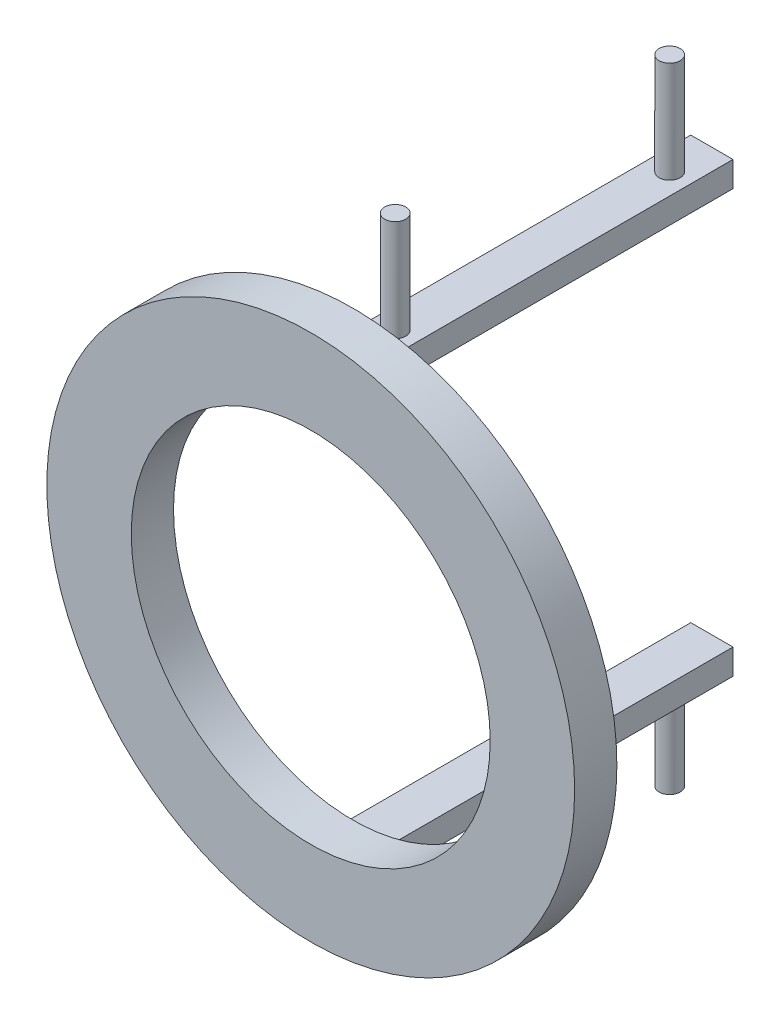
ISO-10303-21;
HEADER;
FILE_DESCRIPTION(('STEP AP214'),'2;1');
FILE_NAME('part.step','',(''),(''),'','','');
FILE_SCHEMA(('AUTOMOTIVE_DESIGN { 1 0 10303 214 1 1 1 1 }'));
ENDSEC;
DATA;
#1=APPLICATION_CONTEXT('core data for automotive mechanical design processes');
#2=APPLICATION_PROTOCOL_DEFINITION('international standard','automotive_design',2000,#1);
#3=PRODUCT_CONTEXT('',#1,'mechanical');
#4=PRODUCT('Part','Part','',(#3));
#5=PRODUCT_RELATED_PRODUCT_CATEGORY('part','',(#4));
#6=PRODUCT_DEFINITION_FORMATION('','',#4);
#7=PRODUCT_DEFINITION_CONTEXT('part definition',#1,'design');
#8=PRODUCT_DEFINITION('design','',#6,#7);
#9=PRODUCT_DEFINITION_SHAPE('','',#8);
#10=(LENGTH_UNIT() NAMED_UNIT(*) SI_UNIT(.MILLI.,.METRE.));
#11=(NAMED_UNIT(*) PLANE_ANGLE_UNIT() SI_UNIT($,.RADIAN.));
#12=(NAMED_UNIT(*) SI_UNIT($,.STERADIAN.) SOLID_ANGLE_UNIT());
#13=UNCERTAINTY_MEASURE_WITH_UNIT(LENGTH_MEASURE(1.E-05),#10,'distance_accuracy_value','');
#14=(GEOMETRIC_REPRESENTATION_CONTEXT(3) GLOBAL_UNCERTAINTY_ASSIGNED_CONTEXT((#13)) GLOBAL_UNIT_ASSIGNED_CONTEXT((#10,
#11,#12)) REPRESENTATION_CONTEXT('',''));
#15=CARTESIAN_POINT('',(0.,0.,0.));
#16=DIRECTION('',(0.,0.,1.));
#17=DIRECTION('',(1.,0.,0.));
#18=AXIS2_PLACEMENT_3D('',#15,#16,#17);
#19=CARTESIAN_POINT('',(0.,0.,0.));
#20=DIRECTION('',(0.,0.,1.));
#21=DIRECTION('',(1.,0.,0.));
#22=AXIS2_PLACEMENT_3D('',#19,#20,#21);
#23=PLANE('',#22);
#24=DIRECTION('',(0.,1.,0.));
#25=VECTOR('',#24,1.);
#26=CARTESIAN_POINT('',(-1.,10.6,0.));
#27=LINE('',#26,#25);
#28=CARTESIAN_POINT('',(-1.,9.4,0.));
#29=VERTEX_POINT('',#28);
#30=CARTESIAN_POINT('',(-1.,10.6,0.));
#31=VERTEX_POINT('',#30);
#32=EDGE_CURVE('E129',#29,#31,#27,.T.);
#33=ORIENTED_EDGE('',*,*,#32,.F.);
#34=DIRECTION('',(-1.,0.,0.));
#35=VECTOR('',#34,1.);
#36=CARTESIAN_POINT('',(1.,9.4,0.));
#37=LINE('',#36,#35);
#38=CARTESIAN_POINT('',(1.,9.4,0.));
#39=VERTEX_POINT('',#38);
#40=EDGE_CURVE('E145',#39,#29,#37,.T.);
#41=ORIENTED_EDGE('',*,*,#40,.F.);
#42=DIRECTION('',(0.,-1.,0.));
#43=VECTOR('',#42,1.);
#44=CARTESIAN_POINT('',(1.,10.6,0.));
#45=LINE('',#44,#43);
#46=CARTESIAN_POINT('',(1.,10.6,0.));
#47=VERTEX_POINT('',#46);
#48=EDGE_CURVE('E158',#47,#39,#45,.T.);
#49=ORIENTED_EDGE('',*,*,#48,.F.);
#50=DIRECTION('',(1.,0.,0.));
#51=VECTOR('',#50,1.);
#52=CARTESIAN_POINT('',(1.,10.6,0.));
#53=LINE('',#52,#51);
#54=EDGE_CURVE('E134',#31,#47,#53,.T.);
#55=ORIENTED_EDGE('',*,*,#54,.F.);
#56=EDGE_LOOP('',(#33,#41,#49,#55));
#57=FACE_BOUND('',#56,.T.);
#58=CARTESIAN_POINT('',(0.,0.,0.));
#59=DIRECTION('',(0.,0.,1.));
#60=DIRECTION('',(1.,0.,0.));
#61=AXIS2_PLACEMENT_3D('',#58,#59,#60);
#62=CIRCLE('',#61,8.5);
#63=CARTESIAN_POINT('',(8.5,0.,0.));
#64=VERTEX_POINT('',#63);
#65=EDGE_CURVE('E181',#64,#64,#62,.T.);
#66=ORIENTED_EDGE('',*,*,#65,.T.);
#67=EDGE_LOOP('',(#66));
#68=FACE_BOUND('',#67,.T.);
#69=CARTESIAN_POINT('',(0.,0.,0.));
#70=DIRECTION('',(0.,0.,1.));
#71=DIRECTION('',(1.,0.,0.));
#72=AXIS2_PLACEMENT_3D('',#69,#70,#71);
#73=CIRCLE('',#72,12.5);
#74=CARTESIAN_POINT('',(12.5,0.,0.));
#75=VERTEX_POINT('',#74);
#76=EDGE_CURVE('E185',#75,#75,#73,.T.);
#77=ORIENTED_EDGE('',*,*,#76,.F.);
#78=EDGE_LOOP('',(#77));
#79=FACE_BOUND('',#78,.T.);
#80=DIRECTION('',(0.,-1.,0.));
#81=VECTOR('',#80,1.);
#82=CARTESIAN_POINT('',(1.,-10.6,0.));
#83=LINE('',#82,#81);
#84=CARTESIAN_POINT('',(1.,-9.4,0.));
#85=VERTEX_POINT('',#84);
#86=CARTESIAN_POINT('',(1.,-10.6,0.));
#87=VERTEX_POINT('',#86);
#88=EDGE_CURVE('E127',#85,#87,#83,.T.);
#89=ORIENTED_EDGE('',*,*,#88,.F.);
#90=DIRECTION('',(1.,0.,0.));
#91=VECTOR('',#90,1.);
#92=CARTESIAN_POINT('',(1.,-9.4,0.));
#93=LINE('',#92,#91);
#94=CARTESIAN_POINT('',(-1.,-9.4,0.));
#95=VERTEX_POINT('',#94);
#96=EDGE_CURVE('E124',#95,#85,#93,.T.);
#97=ORIENTED_EDGE('',*,*,#96,.F.);
#98=DIRECTION('',(0.,1.,0.));
#99=VECTOR('',#98,1.);
#100=CARTESIAN_POINT('',(-1.,-10.6,0.));
#101=LINE('',#100,#99);
#102=CARTESIAN_POINT('',(-1.,-10.6,0.));
#103=VERTEX_POINT('',#102);
#104=EDGE_CURVE('E60',#103,#95,#101,.T.);
#105=ORIENTED_EDGE('',*,*,#104,.F.);
#106=DIRECTION('',(-1.,0.,0.));
#107=VECTOR('',#106,1.);
#108=CARTESIAN_POINT('',(1.,-10.6,0.));
#109=LINE('',#108,#107);
#110=EDGE_CURVE('E55',#87,#103,#109,.T.);
#111=ORIENTED_EDGE('',*,*,#110,.F.);
#112=EDGE_LOOP('',(#89,#97,#105,#111));
#113=FACE_BOUND('',#112,.T.);
#114=ADVANCED_FACE('F39',(#57,#68,#79,#113),#23,.F.);
#115=CARTESIAN_POINT('',(0.,0.,2.));
#116=DIRECTION('',(0.,0.,-1.));
#117=DIRECTION('',(-1.,0.,0.));
#118=AXIS2_PLACEMENT_3D('',#115,#116,#117);
#119=CYLINDRICAL_SURFACE('',#118,12.5);
#120=CARTESIAN_POINT('',(0.,0.,2.));
#121=DIRECTION('',(0.,0.,1.));
#122=DIRECTION('',(1.,0.,0.));
#123=AXIS2_PLACEMENT_3D('',#120,#121,#122);
#124=CIRCLE('',#123,12.5);
#125=CARTESIAN_POINT('',(12.5,0.,2.));
#126=VERTEX_POINT('',#125);
#127=EDGE_CURVE('E189',#126,#126,#124,.T.);
#128=ORIENTED_EDGE('',*,*,#127,.F.);
#129=EDGE_LOOP('',(#128));
#130=FACE_BOUND('',#129,.T.);
#131=ORIENTED_EDGE('',*,*,#76,.T.);
#132=EDGE_LOOP('',(#131));
#133=FACE_BOUND('',#132,.T.);
#134=ADVANCED_FACE('F41',(#130,#133),#119,.T.);
#135=CARTESIAN_POINT('',(0.,0.,2.));
#136=DIRECTION('',(0.,0.,1.));
#137=DIRECTION('',(1.,0.,0.));
#138=AXIS2_PLACEMENT_3D('',#135,#136,#137);
#139=PLANE('',#138);
#140=CARTESIAN_POINT('',(0.,0.,2.));
#141=DIRECTION('',(0.,0.,1.));
#142=DIRECTION('',(1.,0.,0.));
#143=AXIS2_PLACEMENT_3D('',#140,#141,#142);
#144=CIRCLE('',#143,8.5);
#145=CARTESIAN_POINT('',(8.5,0.,2.));
#146=VERTEX_POINT('',#145);
#147=EDGE_CURVE('E180',#146,#146,#144,.T.);
#148=ORIENTED_EDGE('',*,*,#147,.F.);
#149=EDGE_LOOP('',(#148));
#150=FACE_BOUND('',#149,.T.);
#151=ORIENTED_EDGE('',*,*,#127,.T.);
#152=EDGE_LOOP('',(#151));
#153=FACE_BOUND('',#152,.T.);
#154=ADVANCED_FACE('F228',(#150,#153),#139,.T.);
#155=CARTESIAN_POINT('',(0.,0.,0.));
#156=DIRECTION('',(0.,0.,1.));
#157=DIRECTION('',(1.,0.,0.));
#158=AXIS2_PLACEMENT_3D('',#155,#156,#157);
#159=CYLINDRICAL_SURFACE('',#158,8.5);
#160=ORIENTED_EDGE('',*,*,#65,.F.);
#161=EDGE_LOOP('',(#160));
#162=FACE_BOUND('',#161,.T.);
#163=ORIENTED_EDGE('',*,*,#147,.T.);
#164=EDGE_LOOP('',(#163));
#165=FACE_BOUND('',#164,.T.);
#166=ADVANCED_FACE('F234',(#162,#165),#159,.F.);
#167=CARTESIAN_POINT('',(-1.,10.6,-17.));
#168=DIRECTION('',(1.,0.,0.));
#169=DIRECTION('',(0.,0.,-1.));
#170=AXIS2_PLACEMENT_3D('',#167,#168,#169);
#171=PLANE('',#170);
#172=ORIENTED_EDGE('',*,*,#32,.T.);
#173=DIRECTION('',(0.,0.,1.));
#174=VECTOR('',#173,1.);
#175=CARTESIAN_POINT('',(-1.,10.6,-17.));
#176=LINE('',#175,#174);
#177=CARTESIAN_POINT('',(-1.,10.6,-17.));
#178=VERTEX_POINT('',#177);
#179=EDGE_CURVE('E176',#178,#31,#176,.T.);
#180=ORIENTED_EDGE('',*,*,#179,.F.);
#181=DIRECTION('',(0.,1.,0.));
#182=VECTOR('',#181,1.);
#183=CARTESIAN_POINT('',(-1.,10.6,-17.));
#184=LINE('',#183,#182);
#185=CARTESIAN_POINT('',(-1.,9.4,-17.));
#186=VERTEX_POINT('',#185);
#187=EDGE_CURVE('E140',#186,#178,#184,.T.);
#188=ORIENTED_EDGE('',*,*,#187,.F.);
#189=DIRECTION('',(0.,0.,1.));
#190=VECTOR('',#189,1.);
#191=CARTESIAN_POINT('',(-1.,9.4,-17.));
#192=LINE('',#191,#190);
#193=EDGE_CURVE('E153',#186,#29,#192,.T.);
#194=ORIENTED_EDGE('',*,*,#193,.T.);
#195=EDGE_LOOP('',(#172,#180,#188,#194));
#196=FACE_BOUND('',#195,.T.);
#197=ADVANCED_FACE('F238',(#196),#171,.F.);
#198=CARTESIAN_POINT('',(1.,10.6,-17.));
#199=DIRECTION('',(0.,-1.,0.));
#200=DIRECTION('',(0.,0.,-1.));
#201=AXIS2_PLACEMENT_3D('',#198,#199,#200);
#202=PLANE('',#201);
#203=CARTESIAN_POINT('',(0.,10.6,-15.));
#204=DIRECTION('',(0.,-1.,0.));
#205=DIRECTION('',(0.,0.,-1.));
#206=AXIS2_PLACEMENT_3D('',#203,#204,#205);
#207=CIRCLE('',#206,0.5);
#208=CARTESIAN_POINT('',(0.,10.6,-15.5));
#209=VERTEX_POINT('',#208);
#210=EDGE_CURVE('E200',#209,#209,#207,.F.);
#211=ORIENTED_EDGE('',*,*,#210,.F.);
#212=EDGE_LOOP('',(#211));
#213=FACE_BOUND('',#212,.T.);
#214=CARTESIAN_POINT('',(0.,10.6,-2.));
#215=DIRECTION('',(0.,-1.,0.));
#216=DIRECTION('',(0.,0.,-1.));
#217=AXIS2_PLACEMENT_3D('',#214,#215,#216);
#218=CIRCLE('',#217,0.5);
#219=CARTESIAN_POINT('',(0.,10.6,-2.5));
#220=VERTEX_POINT('',#219);
#221=EDGE_CURVE('E193',#220,#220,#218,.F.);
#222=ORIENTED_EDGE('',*,*,#221,.F.);
#223=EDGE_LOOP('',(#222));
#224=FACE_BOUND('',#223,.T.);
#225=ORIENTED_EDGE('',*,*,#54,.T.);
#226=DIRECTION('',(0.,0.,1.));
#227=VECTOR('',#226,1.);
#228=CARTESIAN_POINT('',(1.,10.6,-17.));
#229=LINE('',#228,#227);
#230=CARTESIAN_POINT('',(1.,10.6,-17.));
#231=VERTEX_POINT('',#230);
#232=EDGE_CURVE('E172',#231,#47,#229,.T.);
#233=ORIENTED_EDGE('',*,*,#232,.F.);
#234=DIRECTION('',(1.,0.,0.));
#235=VECTOR('',#234,1.);
#236=CARTESIAN_POINT('',(1.,10.6,-17.));
#237=LINE('',#236,#235);
#238=EDGE_CURVE('E144',#178,#231,#237,.T.);
#239=ORIENTED_EDGE('',*,*,#238,.F.);
#240=ORIENTED_EDGE('',*,*,#179,.T.);
#241=EDGE_LOOP('',(#225,#233,#239,#240));
#242=FACE_BOUND('',#241,.T.);
#243=ADVANCED_FACE('F242',(#213,#224,#242),#202,.F.);
#244=CARTESIAN_POINT('',(1.,10.6,-17.));
#245=DIRECTION('',(-1.,0.,0.));
#246=DIRECTION('',(0.,0.,1.));
#247=AXIS2_PLACEMENT_3D('',#244,#245,#246);
#248=PLANE('',#247);
#249=ORIENTED_EDGE('',*,*,#48,.T.);
#250=DIRECTION('',(0.,0.,1.));
#251=VECTOR('',#250,1.);
#252=CARTESIAN_POINT('',(1.,9.4,-17.));
#253=LINE('',#252,#251);
#254=CARTESIAN_POINT('',(1.,9.4,-17.));
#255=VERTEX_POINT('',#254);
#256=EDGE_CURVE('E168',#255,#39,#253,.T.);
#257=ORIENTED_EDGE('',*,*,#256,.F.);
#258=DIRECTION('',(0.,-1.,0.));
#259=VECTOR('',#258,1.);
#260=CARTESIAN_POINT('',(1.,10.6,-17.));
#261=LINE('',#260,#259);
#262=EDGE_CURVE('E148',#231,#255,#261,.T.);
#263=ORIENTED_EDGE('',*,*,#262,.F.);
#264=ORIENTED_EDGE('',*,*,#232,.T.);
#265=EDGE_LOOP('',(#249,#257,#263,#264));
#266=FACE_BOUND('',#265,.T.);
#267=ADVANCED_FACE('F246',(#266),#248,.F.);
#268=CARTESIAN_POINT('',(1.,9.4,-17.));
#269=DIRECTION('',(0.,1.,0.));
#270=DIRECTION('',(0.,0.,1.));
#271=AXIS2_PLACEMENT_3D('',#268,#269,#270);
#272=PLANE('',#271);
#273=ORIENTED_EDGE('',*,*,#40,.T.);
#274=ORIENTED_EDGE('',*,*,#193,.F.);
#275=DIRECTION('',(-1.,0.,0.));
#276=VECTOR('',#275,1.);
#277=CARTESIAN_POINT('',(1.,9.4,-17.));
#278=LINE('',#277,#276);
#279=EDGE_CURVE('E151',#255,#186,#278,.T.);
#280=ORIENTED_EDGE('',*,*,#279,.F.);
#281=ORIENTED_EDGE('',*,*,#256,.T.);
#282=EDGE_LOOP('',(#273,#274,#280,#281));
#283=FACE_BOUND('',#282,.T.);
#284=ADVANCED_FACE('F250',(#283),#272,.F.);
#285=CARTESIAN_POINT('',(0.,0.,-17.));
#286=DIRECTION('',(0.,0.,-1.));
#287=DIRECTION('',(-1.,0.,0.));
#288=AXIS2_PLACEMENT_3D('',#285,#286,#287);
#289=PLANE('',#288);
#290=ORIENTED_EDGE('',*,*,#187,.T.);
#291=ORIENTED_EDGE('',*,*,#238,.T.);
#292=ORIENTED_EDGE('',*,*,#262,.T.);
#293=ORIENTED_EDGE('',*,*,#279,.T.);
#294=EDGE_LOOP('',(#290,#291,#292,#293));
#295=FACE_BOUND('',#294,.T.);
#296=ADVANCED_FACE('F220',(#295),#289,.T.);
#297=CARTESIAN_POINT('',(1.,-10.6,-17.));
#298=DIRECTION('',(-1.,0.,0.));
#299=DIRECTION('',(0.,0.,1.));
#300=AXIS2_PLACEMENT_3D('',#297,#298,#299);
#301=PLANE('',#300);
#302=ORIENTED_EDGE('',*,*,#88,.T.);
#303=DIRECTION('',(0.,0.,1.));
#304=VECTOR('',#303,1.);
#305=CARTESIAN_POINT('',(1.,-10.6,-17.));
#306=LINE('',#305,#304);
#307=CARTESIAN_POINT('',(1.,-10.6,-17.));
#308=VERTEX_POINT('',#307);
#309=EDGE_CURVE('E106',#308,#87,#306,.T.);
#310=ORIENTED_EDGE('',*,*,#309,.F.);
#311=DIRECTION('',(0.,-1.,0.));
#312=VECTOR('',#311,1.);
#313=CARTESIAN_POINT('',(1.,-10.6,-17.));
#314=LINE('',#313,#312);
#315=CARTESIAN_POINT('',(1.,-9.4,-17.));
#316=VERTEX_POINT('',#315);
#317=EDGE_CURVE('E114',#316,#308,#314,.T.);
#318=ORIENTED_EDGE('',*,*,#317,.F.);
#319=DIRECTION('',(0.,0.,1.));
#320=VECTOR('',#319,1.);
#321=CARTESIAN_POINT('',(1.,-9.4,-17.));
#322=LINE('',#321,#320);
#323=EDGE_CURVE('E413',#316,#85,#322,.T.);
#324=ORIENTED_EDGE('',*,*,#323,.T.);
#325=EDGE_LOOP('',(#302,#310,#318,#324));
#326=FACE_BOUND('',#325,.T.);
#327=ADVANCED_FACE('F126',(#326),#301,.F.);
#328=CARTESIAN_POINT('',(1.,-10.6,-17.));
#329=DIRECTION('',(0.,1.,0.));
#330=DIRECTION('',(0.,0.,1.));
#331=AXIS2_PLACEMENT_3D('',#328,#329,#330);
#332=PLANE('',#331);
#333=CARTESIAN_POINT('',(0.,-10.6,-15.));
#334=DIRECTION('',(0.,1.,0.));
#335=DIRECTION('',(0.,0.,1.));
#336=AXIS2_PLACEMENT_3D('',#333,#334,#335);
#337=CIRCLE('',#336,0.5);
#338=CARTESIAN_POINT('',(0.,-10.6,-14.5));
#339=VERTEX_POINT('',#338);
#340=EDGE_CURVE('E11',#339,#339,#337,.F.);
#341=ORIENTED_EDGE('',*,*,#340,.F.);
#342=EDGE_LOOP('',(#341));
#343=FACE_BOUND('',#342,.T.);
#344=CARTESIAN_POINT('',(0.,-10.6,-2.));
#345=DIRECTION('',(0.,1.,0.));
#346=DIRECTION('',(0.,0.,1.));
#347=AXIS2_PLACEMENT_3D('',#344,#345,#346);
#348=CIRCLE('',#347,0.5);
#349=CARTESIAN_POINT('',(0.,-10.6,-1.5));
#350=VERTEX_POINT('',#349);
#351=EDGE_CURVE('E48',#350,#350,#348,.F.);
#352=ORIENTED_EDGE('',*,*,#351,.F.);
#353=EDGE_LOOP('',(#352));
#354=FACE_BOUND('',#353,.T.);
#355=ORIENTED_EDGE('',*,*,#110,.T.);
#356=DIRECTION('',(0.,0.,1.));
#357=VECTOR('',#356,1.);
#358=CARTESIAN_POINT('',(-1.,-10.6,-17.));
#359=LINE('',#358,#357);
#360=CARTESIAN_POINT('',(-1.,-10.6,-17.));
#361=VERTEX_POINT('',#360);
#362=EDGE_CURVE('E109',#361,#103,#359,.T.);
#363=ORIENTED_EDGE('',*,*,#362,.F.);
#364=DIRECTION('',(-1.,0.,0.));
#365=VECTOR('',#364,1.);
#366=CARTESIAN_POINT('',(1.,-10.6,-17.));
#367=LINE('',#366,#365);
#368=EDGE_CURVE('E102',#308,#361,#367,.T.);
#369=ORIENTED_EDGE('',*,*,#368,.F.);
#370=ORIENTED_EDGE('',*,*,#309,.T.);
#371=EDGE_LOOP('',(#355,#363,#369,#370));
#372=FACE_BOUND('',#371,.T.);
#373=ADVANCED_FACE('F104',(#343,#354,#372),#332,.F.);
#374=CARTESIAN_POINT('',(-1.,-10.6,-17.));
#375=DIRECTION('',(1.,0.,0.));
#376=DIRECTION('',(0.,0.,-1.));
#377=AXIS2_PLACEMENT_3D('',#374,#375,#376);
#378=PLANE('',#377);
#379=ORIENTED_EDGE('',*,*,#104,.T.);
#380=DIRECTION('',(0.,0.,1.));
#381=VECTOR('',#380,1.);
#382=CARTESIAN_POINT('',(-1.,-9.4,-17.));
#383=LINE('',#382,#381);
#384=CARTESIAN_POINT('',(-1.,-9.4,-17.));
#385=VERTEX_POINT('',#384);
#386=EDGE_CURVE('E136',#385,#95,#383,.T.);
#387=ORIENTED_EDGE('',*,*,#386,.F.);
#388=DIRECTION('',(0.,1.,0.));
#389=VECTOR('',#388,1.);
#390=CARTESIAN_POINT('',(-1.,-10.6,-17.));
#391=LINE('',#390,#389);
#392=EDGE_CURVE('E113',#361,#385,#391,.T.);
#393=ORIENTED_EDGE('',*,*,#392,.F.);
#394=ORIENTED_EDGE('',*,*,#362,.T.);
#395=EDGE_LOOP('',(#379,#387,#393,#394));
#396=FACE_BOUND('',#395,.T.);
#397=ADVANCED_FACE('F210',(#396),#378,.F.);
#398=CARTESIAN_POINT('',(1.,-9.4,-17.));
#399=DIRECTION('',(0.,-1.,0.));
#400=DIRECTION('',(0.,0.,-1.));
#401=AXIS2_PLACEMENT_3D('',#398,#399,#400);
#402=PLANE('',#401);
#403=ORIENTED_EDGE('',*,*,#96,.T.);
#404=ORIENTED_EDGE('',*,*,#323,.F.);
#405=DIRECTION('',(1.,0.,0.));
#406=VECTOR('',#405,1.);
#407=CARTESIAN_POINT('',(1.,-9.4,-17.));
#408=LINE('',#407,#406);
#409=EDGE_CURVE('E119',#385,#316,#408,.T.);
#410=ORIENTED_EDGE('',*,*,#409,.F.);
#411=ORIENTED_EDGE('',*,*,#386,.T.);
#412=EDGE_LOOP('',(#403,#404,#410,#411));
#413=FACE_BOUND('',#412,.T.);
#414=ADVANCED_FACE('F217',(#413),#402,.F.);
#415=CARTESIAN_POINT('',(0.,0.,-17.));
#416=DIRECTION('',(0.,0.,1.));
#417=DIRECTION('',(1.,0.,0.));
#418=AXIS2_PLACEMENT_3D('',#415,#416,#417);
#419=PLANE('',#418);
#420=ORIENTED_EDGE('',*,*,#317,.T.);
#421=ORIENTED_EDGE('',*,*,#368,.T.);
#422=ORIENTED_EDGE('',*,*,#392,.T.);
#423=ORIENTED_EDGE('',*,*,#409,.T.);
#424=EDGE_LOOP('',(#420,#421,#422,#423));
#425=FACE_BOUND('',#424,.T.);
#426=ADVANCED_FACE('F117',(#425),#419,.F.);
#427=CARTESIAN_POINT('',(0.,15.4,-2.));
#428=DIRECTION('',(0.,-1.,0.));
#429=DIRECTION('',(0.,0.,-1.));
#430=AXIS2_PLACEMENT_3D('',#427,#428,#429);
#431=CYLINDRICAL_SURFACE('',#430,0.5);
#432=CARTESIAN_POINT('',(0.,15.4,-2.));
#433=DIRECTION('',(0.,1.,0.));
#434=DIRECTION('',(0.,0.,1.));
#435=AXIS2_PLACEMENT_3D('',#432,#433,#434);
#436=CIRCLE('',#435,0.5);
#437=CARTESIAN_POINT('',(0.,15.4,-1.5));
#438=VERTEX_POINT('',#437);
#439=EDGE_CURVE('E405',#438,#438,#436,.T.);
#440=ORIENTED_EDGE('',*,*,#439,.F.);
#441=EDGE_LOOP('',(#440));
#442=FACE_BOUND('',#441,.T.);
#443=ORIENTED_EDGE('',*,*,#221,.T.);
#444=EDGE_LOOP('',(#443));
#445=FACE_BOUND('',#444,.T.);
#446=ADVANCED_FACE('F298',(#442,#445),#431,.T.);
#447=CARTESIAN_POINT('',(0.,15.4,-2.));
#448=DIRECTION('',(0.,1.,0.));
#449=DIRECTION('',(0.,0.,1.));
#450=AXIS2_PLACEMENT_3D('',#447,#448,#449);
#451=PLANE('',#450);
#452=ORIENTED_EDGE('',*,*,#439,.T.);
#453=EDGE_LOOP('',(#452));
#454=FACE_BOUND('',#453,.T.);
#455=ADVANCED_FACE('F315',(#454),#451,.T.);
#456=CARTESIAN_POINT('',(0.,15.4,-15.));
#457=DIRECTION('',(0.,-1.,0.));
#458=DIRECTION('',(0.,0.,-1.));
#459=AXIS2_PLACEMENT_3D('',#456,#457,#458);
#460=CYLINDRICAL_SURFACE('',#459,0.5);
#461=CARTESIAN_POINT('',(0.,15.4,-15.));
#462=DIRECTION('',(0.,1.,0.));
#463=DIRECTION('',(0.,0.,1.));
#464=AXIS2_PLACEMENT_3D('',#461,#462,#463);
#465=CIRCLE('',#464,0.5);
#466=CARTESIAN_POINT('',(0.,15.4,-14.5));
#467=VERTEX_POINT('',#466);
#468=EDGE_CURVE('E399',#467,#467,#465,.T.);
#469=ORIENTED_EDGE('',*,*,#468,.F.);
#470=EDGE_LOOP('',(#469));
#471=FACE_BOUND('',#470,.T.);
#472=ORIENTED_EDGE('',*,*,#210,.T.);
#473=EDGE_LOOP('',(#472));
#474=FACE_BOUND('',#473,.T.);
#475=ADVANCED_FACE('F325',(#471,#474),#460,.T.);
#476=CARTESIAN_POINT('',(0.,15.4,-15.));
#477=DIRECTION('',(0.,1.,0.));
#478=DIRECTION('',(0.,0.,1.));
#479=AXIS2_PLACEMENT_3D('',#476,#477,#478);
#480=PLANE('',#479);
#481=ORIENTED_EDGE('',*,*,#468,.T.);
#482=EDGE_LOOP('',(#481));
#483=FACE_BOUND('',#482,.T.);
#484=ADVANCED_FACE('F335',(#483),#480,.T.);
#485=CARTESIAN_POINT('',(0.,-14.6,-2.));
#486=DIRECTION('',(0.,1.,0.));
#487=DIRECTION('',(0.,0.,1.));
#488=AXIS2_PLACEMENT_3D('',#485,#486,#487);
#489=CYLINDRICAL_SURFACE('',#488,0.5);
#490=CARTESIAN_POINT('',(0.,-14.6,-2.));
#491=DIRECTION('',(0.,-1.,0.));
#492=DIRECTION('',(0.,0.,-1.));
#493=AXIS2_PLACEMENT_3D('',#490,#491,#492);
#494=CIRCLE('',#493,0.5);
#495=CARTESIAN_POINT('',(0.,-14.6,-2.5));
#496=VERTEX_POINT('',#495);
#497=EDGE_CURVE('E395',#496,#496,#494,.T.);
#498=ORIENTED_EDGE('',*,*,#497,.F.);
#499=EDGE_LOOP('',(#498));
#500=FACE_BOUND('',#499,.T.);
#501=ORIENTED_EDGE('',*,*,#351,.T.);
#502=EDGE_LOOP('',(#501));
#503=FACE_BOUND('',#502,.T.);
#504=ADVANCED_FACE('F207',(#500,#503),#489,.T.);
#505=CARTESIAN_POINT('',(0.,-14.6,-2.));
#506=DIRECTION('',(0.,-1.,0.));
#507=DIRECTION('',(0.,0.,-1.));
#508=AXIS2_PLACEMENT_3D('',#505,#506,#507);
#509=PLANE('',#508);
#510=ORIENTED_EDGE('',*,*,#497,.T.);
#511=EDGE_LOOP('',(#510));
#512=FACE_BOUND('',#511,.T.);
#513=ADVANCED_FACE('F357',(#512),#509,.T.);
#514=CARTESIAN_POINT('',(0.,-14.6,-15.));
#515=DIRECTION('',(0.,1.,0.));
#516=DIRECTION('',(0.,0.,1.));
#517=AXIS2_PLACEMENT_3D('',#514,#515,#516);
#518=CYLINDRICAL_SURFACE('',#517,0.5);
#519=CARTESIAN_POINT('',(0.,-14.6,-15.));
#520=DIRECTION('',(0.,-1.,0.));
#521=DIRECTION('',(0.,0.,-1.));
#522=AXIS2_PLACEMENT_3D('',#519,#520,#521);
#523=CIRCLE('',#522,0.5);
#524=CARTESIAN_POINT('',(0.,-14.6,-15.5));
#525=VERTEX_POINT('',#524);
#526=EDGE_CURVE('E393',#525,#525,#523,.T.);
#527=ORIENTED_EDGE('',*,*,#526,.F.);
#528=EDGE_LOOP('',(#527));
#529=FACE_BOUND('',#528,.T.);
#530=ORIENTED_EDGE('',*,*,#340,.T.);
#531=EDGE_LOOP('',(#530));
#532=FACE_BOUND('',#531,.T.);
#533=ADVANCED_FACE('F367',(#529,#532),#518,.T.);
#534=CARTESIAN_POINT('',(0.,-14.6,-15.));
#535=DIRECTION('',(0.,-1.,0.));
#536=DIRECTION('',(0.,0.,-1.));
#537=AXIS2_PLACEMENT_3D('',#534,#535,#536);
#538=PLANE('',#537);
#539=ORIENTED_EDGE('',*,*,#526,.T.);
#540=EDGE_LOOP('',(#539));
#541=FACE_BOUND('',#540,.T.);
#542=ADVANCED_FACE('F377',(#541),#538,.T.);
#543=CLOSED_SHELL('',(#114,#134,#154,#166,#197,#243,#267,#284,#296,#327,#373,#397,#414,#426,
#446,#455,#475,#484,#504,#513,#533,#542));
#544=MANIFOLD_SOLID_BREP('B2',#543);
#545=ADVANCED_BREP_SHAPE_REPRESENTATION('',(#18,#544),#14);
#546=SHAPE_DEFINITION_REPRESENTATION(#9,#545);
ENDSEC;
END-ISO-10303-21;
